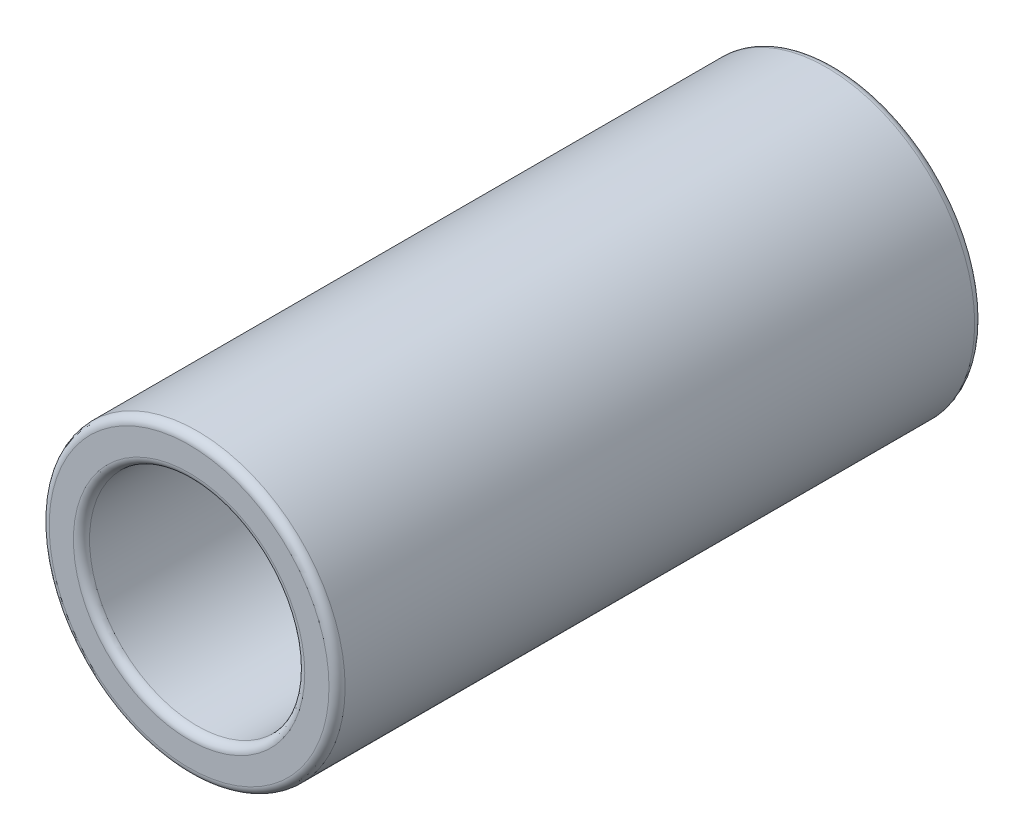
ISO-10303-21;
HEADER;
FILE_DESCRIPTION(('STEP AP214'),'2;1');
FILE_NAME('part.step','',(''),(''),'','','');
FILE_SCHEMA(('AUTOMOTIVE_DESIGN { 1 0 10303 214 1 1 1 1 }'));
ENDSEC;
DATA;
#1=APPLICATION_CONTEXT('core data for automotive mechanical design processes');
#2=APPLICATION_PROTOCOL_DEFINITION('international standard','automotive_design',2000,#1);
#3=PRODUCT_CONTEXT('',#1,'mechanical');
#4=PRODUCT('Part','Part','',(#3));
#5=PRODUCT_RELATED_PRODUCT_CATEGORY('part','',(#4));
#6=PRODUCT_DEFINITION_FORMATION('','',#4);
#7=PRODUCT_DEFINITION_CONTEXT('part definition',#1,'design');
#8=PRODUCT_DEFINITION('design','',#6,#7);
#9=PRODUCT_DEFINITION_SHAPE('','',#8);
#10=(LENGTH_UNIT() NAMED_UNIT(*) SI_UNIT(.MILLI.,.METRE.));
#11=(NAMED_UNIT(*) PLANE_ANGLE_UNIT() SI_UNIT($,.RADIAN.));
#12=(NAMED_UNIT(*) SI_UNIT($,.STERADIAN.) SOLID_ANGLE_UNIT());
#13=UNCERTAINTY_MEASURE_WITH_UNIT(LENGTH_MEASURE(1.E-05),#10,'distance_accuracy_value','');
#14=(GEOMETRIC_REPRESENTATION_CONTEXT(3) GLOBAL_UNCERTAINTY_ASSIGNED_CONTEXT((#13)) GLOBAL_UNIT_ASSIGNED_CONTEXT((#10,
#11,#12)) REPRESENTATION_CONTEXT('',''));
#15=CARTESIAN_POINT('',(0.,0.,0.));
#16=DIRECTION('',(0.,0.,1.));
#17=DIRECTION('',(1.,0.,0.));
#18=AXIS2_PLACEMENT_3D('',#15,#16,#17);
#19=CARTESIAN_POINT('',(0.,0.,24.));
#20=DIRECTION('',(0.,0.,1.));
#21=DIRECTION('',(1.,0.,0.));
#22=AXIS2_PLACEMENT_3D('',#19,#20,#21);
#23=PLANE('',#22);
#24=CARTESIAN_POINT('',(0.,0.,24.));
#25=DIRECTION('',(0.,0.,1.));
#26=DIRECTION('',(1.,0.,0.));
#27=AXIS2_PLACEMENT_3D('',#24,#25,#26);
#28=CIRCLE('',#27,4.3);
#29=CARTESIAN_POINT('',(4.3,0.,24.));
#30=VERTEX_POINT('',#29);
#31=EDGE_CURVE('E10',#30,#30,#28,.F.);
#32=ORIENTED_EDGE('',*,*,#31,.T.);
#33=EDGE_LOOP('',(#32));
#34=FACE_BOUND('',#33,.T.);
#35=CARTESIAN_POINT('',(0.,0.,24.));
#36=DIRECTION('',(0.,0.,1.));
#37=DIRECTION('',(1.,0.,0.));
#38=AXIS2_PLACEMENT_3D('',#35,#36,#37);
#39=CIRCLE('',#38,5.2);
#40=CARTESIAN_POINT('',(5.2,0.,24.));
#41=VERTEX_POINT('',#40);
#42=EDGE_CURVE('E38',#41,#41,#39,.T.);
#43=ORIENTED_EDGE('',*,*,#42,.T.);
#44=EDGE_LOOP('',(#43));
#45=FACE_BOUND('',#44,.T.);
#46=ADVANCED_FACE('F31',(#34,#45),#23,.T.);
#47=CARTESIAN_POINT('',(0.,0.,0.));
#48=DIRECTION('',(0.,0.,1.));
#49=DIRECTION('',(1.,0.,0.));
#50=AXIS2_PLACEMENT_3D('',#47,#48,#49);
#51=PLANE('',#50);
#52=CARTESIAN_POINT('',(0.,0.,0.));
#53=DIRECTION('',(0.,0.,1.));
#54=DIRECTION('',(1.,0.,0.));
#55=AXIS2_PLACEMENT_3D('',#52,#53,#54);
#56=CIRCLE('',#55,5.2);
#57=CARTESIAN_POINT('',(5.2,0.,0.));
#58=VERTEX_POINT('',#57);
#59=EDGE_CURVE('E51',#58,#58,#56,.F.);
#60=ORIENTED_EDGE('',*,*,#59,.T.);
#61=EDGE_LOOP('',(#60));
#62=FACE_BOUND('',#61,.T.);
#63=CARTESIAN_POINT('',(0.,0.,0.));
#64=DIRECTION('',(0.,0.,1.));
#65=DIRECTION('',(1.,0.,0.));
#66=AXIS2_PLACEMENT_3D('',#63,#64,#65);
#67=CIRCLE('',#66,4.3);
#68=CARTESIAN_POINT('',(4.3,0.,0.));
#69=VERTEX_POINT('',#68);
#70=EDGE_CURVE('E54',#69,#69,#67,.T.);
#71=ORIENTED_EDGE('',*,*,#70,.T.);
#72=EDGE_LOOP('',(#71));
#73=FACE_BOUND('',#72,.T.);
#74=ADVANCED_FACE('F75',(#62,#73),#51,.F.);
#75=CARTESIAN_POINT('',(0.,0.,24.));
#76=DIRECTION('',(0.,0.,-1.));
#77=DIRECTION('',(-1.,0.,0.));
#78=AXIS2_PLACEMENT_3D('',#75,#76,#77);
#79=CYLINDRICAL_SURFACE('',#78,5.5);
#80=CARTESIAN_POINT('',(0.,0.,0.300000000000002));
#81=DIRECTION('',(0.,0.,1.));
#82=DIRECTION('',(1.,0.,0.));
#83=AXIS2_PLACEMENT_3D('',#80,#81,#82);
#84=CIRCLE('',#83,5.5);
#85=CARTESIAN_POINT('',(5.5,0.,0.300000000000002));
#86=VERTEX_POINT('',#85);
#87=EDGE_CURVE('E57',#86,#86,#84,.T.);
#88=ORIENTED_EDGE('',*,*,#87,.T.);
#89=EDGE_LOOP('',(#88));
#90=FACE_BOUND('',#89,.T.);
#91=CARTESIAN_POINT('',(0.,0.,23.7));
#92=DIRECTION('',(0.,0.,1.));
#93=DIRECTION('',(1.,0.,0.));
#94=AXIS2_PLACEMENT_3D('',#91,#92,#93);
#95=CIRCLE('',#94,5.5);
#96=CARTESIAN_POINT('',(5.5,0.,23.7));
#97=VERTEX_POINT('',#96);
#98=EDGE_CURVE('E60',#97,#97,#95,.F.);
#99=ORIENTED_EDGE('',*,*,#98,.T.);
#100=EDGE_LOOP('',(#99));
#101=FACE_BOUND('',#100,.T.);
#102=ADVANCED_FACE('F64',(#90,#101),#79,.T.);
#103=CARTESIAN_POINT('',(0.,0.,24.));
#104=DIRECTION('',(0.,0.,-1.));
#105=DIRECTION('',(-1.,0.,0.));
#106=AXIS2_PLACEMENT_3D('',#103,#104,#105);
#107=CYLINDRICAL_SURFACE('',#106,4.);
#108=CARTESIAN_POINT('',(0.,0.,0.300000000000002));
#109=DIRECTION('',(0.,0.,1.));
#110=DIRECTION('',(1.,0.,0.));
#111=AXIS2_PLACEMENT_3D('',#108,#109,#110);
#112=CIRCLE('',#111,4.);
#113=CARTESIAN_POINT('',(4.,0.,0.300000000000002));
#114=VERTEX_POINT('',#113);
#115=EDGE_CURVE('E42',#114,#114,#112,.F.);
#116=ORIENTED_EDGE('',*,*,#115,.T.);
#117=EDGE_LOOP('',(#116));
#118=FACE_BOUND('',#117,.T.);
#119=CARTESIAN_POINT('',(0.,0.,23.7));
#120=DIRECTION('',(0.,0.,1.));
#121=DIRECTION('',(1.,0.,0.));
#122=AXIS2_PLACEMENT_3D('',#119,#120,#121);
#123=CIRCLE('',#122,4.);
#124=CARTESIAN_POINT('',(4.,0.,23.7));
#125=VERTEX_POINT('',#124);
#126=EDGE_CURVE('E46',#125,#125,#123,.T.);
#127=ORIENTED_EDGE('',*,*,#126,.T.);
#128=EDGE_LOOP('',(#127));
#129=FACE_BOUND('',#128,.T.);
#130=ADVANCED_FACE('F83',(#118,#129),#107,.F.);
#131=CARTESIAN_POINT('',(0.,0.,0.300000000000002));
#132=DIRECTION('',(0.,0.,1.));
#133=DIRECTION('',(1.,0.,0.));
#134=AXIS2_PLACEMENT_3D('',#131,#132,#133);
#135=TOROIDAL_SURFACE('',#134,5.2,0.3);
#136=ORIENTED_EDGE('',*,*,#59,.F.);
#137=EDGE_LOOP('',(#136));
#138=FACE_BOUND('',#137,.T.);
#139=ORIENTED_EDGE('',*,*,#87,.F.);
#140=EDGE_LOOP('',(#139));
#141=FACE_BOUND('',#140,.T.);
#142=ADVANCED_FACE('F88',(#138,#141),#135,.T.);
#143=CARTESIAN_POINT('',(0.,0.,0.300000000000002));
#144=DIRECTION('',(0.,0.,1.));
#145=DIRECTION('',(1.,0.,0.));
#146=AXIS2_PLACEMENT_3D('',#143,#144,#145);
#147=TOROIDAL_SURFACE('',#146,4.3,0.3);
#148=ORIENTED_EDGE('',*,*,#115,.F.);
#149=EDGE_LOOP('',(#148));
#150=FACE_BOUND('',#149,.T.);
#151=ORIENTED_EDGE('',*,*,#70,.F.);
#152=EDGE_LOOP('',(#151));
#153=FACE_BOUND('',#152,.T.);
#154=ADVANCED_FACE('F72',(#150,#153),#147,.T.);
#155=CARTESIAN_POINT('',(0.,0.,23.7));
#156=DIRECTION('',(0.,0.,1.));
#157=DIRECTION('',(1.,0.,0.));
#158=AXIS2_PLACEMENT_3D('',#155,#156,#157);
#159=TOROIDAL_SURFACE('',#158,4.3,0.3);
#160=ORIENTED_EDGE('',*,*,#31,.F.);
#161=EDGE_LOOP('',(#160));
#162=FACE_BOUND('',#161,.T.);
#163=ORIENTED_EDGE('',*,*,#126,.F.);
#164=EDGE_LOOP('',(#163));
#165=FACE_BOUND('',#164,.T.);
#166=ADVANCED_FACE('F68',(#162,#165),#159,.T.);
#167=CARTESIAN_POINT('',(0.,0.,23.7));
#168=DIRECTION('',(0.,0.,1.));
#169=DIRECTION('',(1.,0.,0.));
#170=AXIS2_PLACEMENT_3D('',#167,#168,#169);
#171=TOROIDAL_SURFACE('',#170,5.2,0.3);
#172=ORIENTED_EDGE('',*,*,#98,.F.);
#173=EDGE_LOOP('',(#172));
#174=FACE_BOUND('',#173,.T.);
#175=ORIENTED_EDGE('',*,*,#42,.F.);
#176=EDGE_LOOP('',(#175));
#177=FACE_BOUND('',#176,.T.);
#178=ADVANCED_FACE('F33',(#174,#177),#171,.T.);
#179=CLOSED_SHELL('',(#46,#74,#102,#130,#142,#154,#166,#178));
#180=MANIFOLD_SOLID_BREP('B2',#179);
#181=ADVANCED_BREP_SHAPE_REPRESENTATION('',(#18,#180),#14);
#182=SHAPE_DEFINITION_REPRESENTATION(#9,#181);
ENDSEC;
END-ISO-10303-21;
